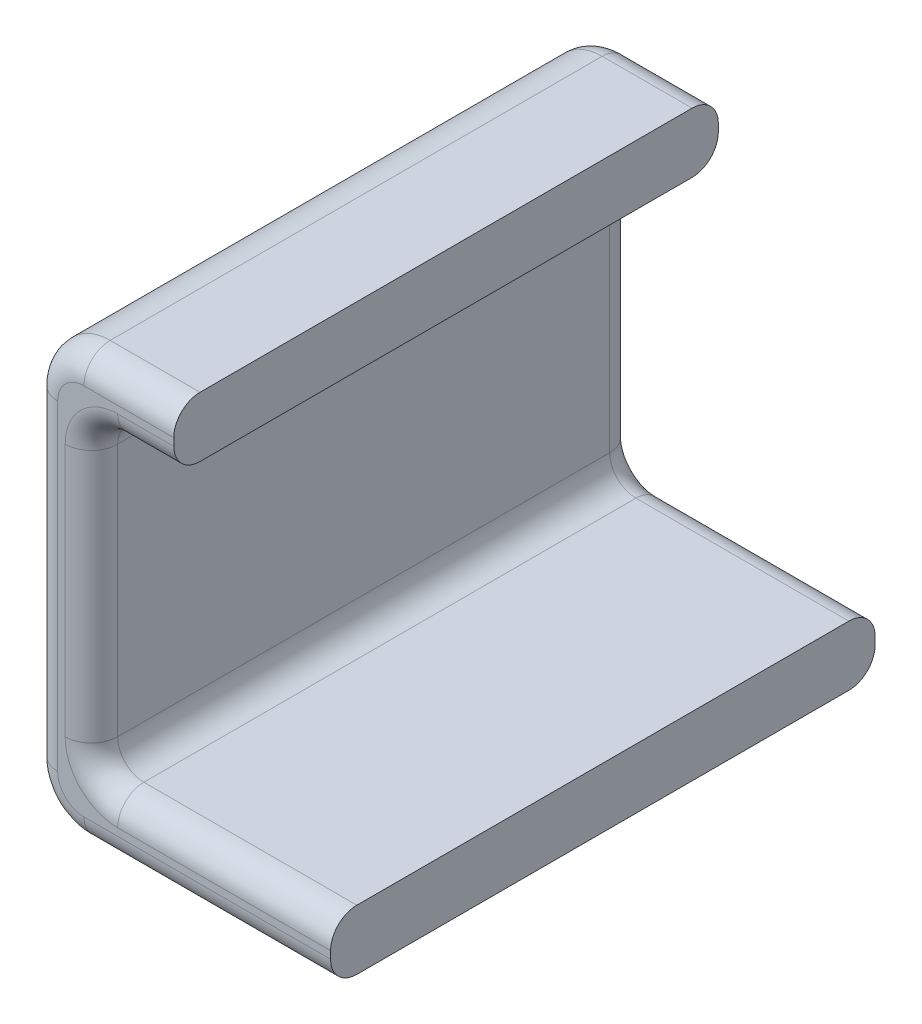
ISO-10303-21;
HEADER;
FILE_DESCRIPTION(('STEP AP214'),'2;1');
FILE_NAME('part.step','',(''),(''),'','','');
FILE_SCHEMA(('AUTOMOTIVE_DESIGN { 1 0 10303 214 1 1 1 1 }'));
ENDSEC;
DATA;
#1=APPLICATION_CONTEXT('core data for automotive mechanical design processes');
#2=APPLICATION_PROTOCOL_DEFINITION('international standard','automotive_design',2000,#1);
#3=PRODUCT_CONTEXT('',#1,'mechanical');
#4=PRODUCT('Part','Part','',(#3));
#5=PRODUCT_RELATED_PRODUCT_CATEGORY('part','',(#4));
#6=PRODUCT_DEFINITION_FORMATION('','',#4);
#7=PRODUCT_DEFINITION_CONTEXT('part definition',#1,'design');
#8=PRODUCT_DEFINITION('design','',#6,#7);
#9=PRODUCT_DEFINITION_SHAPE('','',#8);
#10=(LENGTH_UNIT() NAMED_UNIT(*) SI_UNIT(.MILLI.,.METRE.));
#11=(NAMED_UNIT(*) PLANE_ANGLE_UNIT() SI_UNIT($,.RADIAN.));
#12=(NAMED_UNIT(*) SI_UNIT($,.STERADIAN.) SOLID_ANGLE_UNIT());
#13=UNCERTAINTY_MEASURE_WITH_UNIT(LENGTH_MEASURE(1.E-05),#10,'distance_accuracy_value','');
#14=(GEOMETRIC_REPRESENTATION_CONTEXT(3) GLOBAL_UNCERTAINTY_ASSIGNED_CONTEXT((#13)) GLOBAL_UNIT_ASSIGNED_CONTEXT((#10,
#11,#12)) REPRESENTATION_CONTEXT('',''));
#15=CARTESIAN_POINT('',(0.,0.,0.));
#16=DIRECTION('',(0.,0.,1.));
#17=DIRECTION('',(1.,0.,0.));
#18=AXIS2_PLACEMENT_3D('',#15,#16,#17);
#19=CARTESIAN_POINT('',(-0.344802691004,-0.07991600827582,2.075));
#20=DIRECTION('',(0.,0.,1.));
#21=DIRECTION('',(1.,0.,0.));
#22=AXIS2_PLACEMENT_3D('',#19,#20,#21);
#23=PLANE('',#22);
#24=DIRECTION('',(-1.,0.,0.));
#25=VECTOR('',#24,1.);
#26=CARTESIAN_POINT('',(-0.408714725784,0.738201292228,2.075));
#27=LINE('',#26,#25);
#28=CARTESIAN_POINT('',(-0.158626760563,0.738201292228,2.075));
#29=VERTEX_POINT('',#28);
#30=CARTESIAN_POINT('',(-0.372626760563,0.738201292228,2.075));
#31=VERTEX_POINT('',#30);
#32=EDGE_CURVE('E253',#29,#31,#27,.T.);
#33=ORIENTED_EDGE('',*,*,#32,.F.);
#34=DIRECTION('',(0.,1.,0.));
#35=VECTOR('',#34,1.);
#36=CARTESIAN_POINT('',(-0.158626760563,0.866701292228,2.075));
#37=LINE('',#36,#35);
#38=CARTESIAN_POINT('',(-0.158626760563,0.766701292228,2.075));
#39=VERTEX_POINT('',#38);
#40=EDGE_CURVE('E11',#29,#39,#37,.T.);
#41=ORIENTED_EDGE('',*,*,#40,.T.);
#42=DIRECTION('',(1.,0.,0.));
#43=VECTOR('',#42,1.);
#44=CARTESIAN_POINT('',(-0.251714725784,0.766701292228,2.075));
#45=LINE('',#44,#43);
#46=CARTESIAN_POINT('',(-0.501126760563,0.766701292228,2.075));
#47=VERTEX_POINT('',#46);
#48=EDGE_CURVE('E444',#47,#39,#45,.T.);
#49=ORIENTED_EDGE('',*,*,#48,.F.);
#50=CARTESIAN_POINT('',(-0.501126760563,0.666701292228,2.075));
#51=DIRECTION('',(0.,0.,-1.));
#52=DIRECTION('',(-0.707106781186548,0.707106781186548,0.));
#53=AXIS2_PLACEMENT_3D('',#50,#51,#52);
#54=CIRCLE('',#53,0.1);
#55=CARTESIAN_POINT('',(-0.601126760563,0.666701292228,2.075));
#56=VERTEX_POINT('',#55);
#57=EDGE_CURVE('E383',#56,#47,#54,.T.);
#58=ORIENTED_EDGE('',*,*,#57,.F.);
#59=DIRECTION('',(0.,1.,0.));
#60=VECTOR('',#59,1.);
#61=CARTESIAN_POINT('',(-0.601126760563,0.393392641976,2.075));
#62=LINE('',#61,#60);
#63=CARTESIAN_POINT('',(-0.601126760563,-0.555798707772,2.075));
#64=VERTEX_POINT('',#63);
#65=EDGE_CURVE('E387',#64,#56,#62,.T.);
#66=ORIENTED_EDGE('',*,*,#65,.F.);
#67=CARTESIAN_POINT('',(-0.501126760563,-0.555798707772,2.075));
#68=DIRECTION('',(0.,0.,-1.));
#69=DIRECTION('',(-0.707106781186548,-0.707106781186548,0.));
#70=AXIS2_PLACEMENT_3D('',#67,#68,#69);
#71=CIRCLE('',#70,0.1);
#72=CARTESIAN_POINT('',(-0.501126760563,-0.655798707772,2.075));
#73=VERTEX_POINT('',#72);
#74=EDGE_CURVE('E20',#73,#64,#71,.T.);
#75=ORIENTED_EDGE('',*,*,#74,.F.);
#76=DIRECTION('',(-1.,0.,0.));
#77=VECTOR('',#76,1.);
#78=CARTESIAN_POINT('',(-0.522964725784,-0.655798707772,2.075));
#79=LINE('',#78,#77);
#80=CARTESIAN_POINT('',(0.438873239437,-0.655798707772,2.075));
#81=VERTEX_POINT('',#80);
#82=EDGE_CURVE('E26',#81,#73,#79,.T.);
#83=ORIENTED_EDGE('',*,*,#82,.F.);
#84=DIRECTION('',(0.,1.,0.));
#85=VECTOR('',#84,1.);
#86=CARTESIAN_POINT('',(0.438873239437,-0.527298707772,2.075));
#87=LINE('',#86,#85);
#88=CARTESIAN_POINT('',(0.438873239437,-0.627298707772,2.075));
#89=VERTEX_POINT('',#88);
#90=EDGE_CURVE('E271',#81,#89,#87,.T.);
#91=ORIENTED_EDGE('',*,*,#90,.T.);
#92=DIRECTION('',(1.,0.,0.));
#93=VECTOR('',#92,1.);
#94=CARTESIAN_POINT('',(0.04703527421641,-0.627298707772,2.075));
#95=LINE('',#94,#93);
#96=CARTESIAN_POINT('',(-0.372626760563,-0.627298707772,2.075));
#97=VERTEX_POINT('',#96);
#98=EDGE_CURVE('E318',#97,#89,#95,.T.);
#99=ORIENTED_EDGE('',*,*,#98,.F.);
#100=CARTESIAN_POINT('',(-0.372626760563,-0.427298707772,2.075));
#101=DIRECTION('',(0.,0.,1.));
#102=DIRECTION('',(-0.707106781186548,-0.707106781186548,0.));
#103=AXIS2_PLACEMENT_3D('',#100,#101,#102);
#104=CIRCLE('',#103,0.2);
#105=CARTESIAN_POINT('',(-0.572626760563,-0.427298707772,2.075));
#106=VERTEX_POINT('',#105);
#107=EDGE_CURVE('E354',#106,#97,#104,.T.);
#108=ORIENTED_EDGE('',*,*,#107,.F.);
#109=DIRECTION('',(0.,-1.,0.));
#110=VECTOR('',#109,1.);
#111=CARTESIAN_POINT('',(-0.572626760563,-0.303607358024,2.075));
#112=LINE('',#111,#110);
#113=CARTESIAN_POINT('',(-0.572626760563,0.538201292228,2.075));
#114=VERTEX_POINT('',#113);
#115=EDGE_CURVE('E333',#114,#106,#112,.T.);
#116=ORIENTED_EDGE('',*,*,#115,.F.);
#117=CARTESIAN_POINT('',(-0.372626760563,0.538201292228,2.075));
#118=DIRECTION('',(0.,0.,1.));
#119=DIRECTION('',(-0.707106781186548,0.707106781186548,0.));
#120=AXIS2_PLACEMENT_3D('',#117,#118,#119);
#121=CIRCLE('',#120,0.2);
#122=EDGE_CURVE('E267',#31,#114,#121,.T.);
#123=ORIENTED_EDGE('',*,*,#122,.F.);
#124=EDGE_LOOP('',(#33,#41,#49,#58,#66,#75,#83,#91,#99,#108,#116,#123));
#125=FACE_BOUND('',#124,.T.);
#126=ADVANCED_FACE('F17',(#125),#23,.T.);
#127=CARTESIAN_POINT('',(-0.158626760563,0.638201292228,0.));
#128=DIRECTION('',(1.,0.,0.));
#129=DIRECTION('',(0.,1.,0.));
#130=AXIS2_PLACEMENT_3D('',#127,#128,#129);
#131=PLANE('',#130);
#132=CARTESIAN_POINT('',(-0.158626760563,0.738201292228,0.1));
#133=DIRECTION('',(-1.,0.,0.));
#134=DIRECTION('',(0.,-0.707106781186548,-0.707106781186548));
#135=AXIS2_PLACEMENT_3D('',#132,#133,#134);
#136=CIRCLE('',#135,0.1);
#137=CARTESIAN_POINT('',(-0.158626760563,0.738201292228,0.));
#138=VERTEX_POINT('',#137);
#139=CARTESIAN_POINT('',(-0.158626760563,0.638201292228,0.1));
#140=VERTEX_POINT('',#139);
#141=EDGE_CURVE('E520',#138,#140,#136,.T.);
#142=ORIENTED_EDGE('',*,*,#141,.F.);
#143=DIRECTION('',(0.,-1.,0.));
#144=VECTOR('',#143,1.);
#145=CARTESIAN_POINT('',(-0.158626760563,0.866701292228,0.));
#146=LINE('',#145,#144);
#147=CARTESIAN_POINT('',(-0.158626760563,0.766701292228,0.));
#148=VERTEX_POINT('',#147);
#149=EDGE_CURVE('E409',#148,#138,#146,.T.);
#150=ORIENTED_EDGE('',*,*,#149,.F.);
#151=CARTESIAN_POINT('',(-0.158626760563,0.766701292228,0.1));
#152=DIRECTION('',(-1.,0.,0.));
#153=DIRECTION('',(0.,0.707106781186548,-0.707106781186548));
#154=AXIS2_PLACEMENT_3D('',#151,#152,#153);
#155=CIRCLE('',#154,0.1);
#156=CARTESIAN_POINT('',(-0.158626760563,0.866701292228,0.1));
#157=VERTEX_POINT('',#156);
#158=EDGE_CURVE('E312',#157,#148,#155,.T.);
#159=ORIENTED_EDGE('',*,*,#158,.F.);
#160=DIRECTION('',(0.,0.,1.));
#161=VECTOR('',#160,1.);
#162=CARTESIAN_POINT('',(-0.158626760563,0.866701292228,0.));
#163=LINE('',#162,#161);
#164=CARTESIAN_POINT('',(-0.158626760563,0.866701292228,1.975));
#165=VERTEX_POINT('',#164);
#166=EDGE_CURVE('E328',#157,#165,#163,.T.);
#167=ORIENTED_EDGE('',*,*,#166,.T.);
#168=CARTESIAN_POINT('',(-0.158626760563,0.766701292228,1.975));
#169=DIRECTION('',(-1.,0.,0.));
#170=DIRECTION('',(0.,0.707106781186548,0.707106781186548));
#171=AXIS2_PLACEMENT_3D('',#168,#169,#170);
#172=CIRCLE('',#171,0.1);
#173=EDGE_CURVE('E382',#39,#165,#172,.T.);
#174=ORIENTED_EDGE('',*,*,#173,.F.);
#175=ORIENTED_EDGE('',*,*,#40,.F.);
#176=CARTESIAN_POINT('',(-0.158626760563,0.738201292228,1.975));
#177=DIRECTION('',(-1.,0.,0.));
#178=DIRECTION('',(0.,-0.707106781186548,0.707106781186548));
#179=AXIS2_PLACEMENT_3D('',#176,#177,#178);
#180=CIRCLE('',#179,0.1);
#181=CARTESIAN_POINT('',(-0.158626760563,0.638201292228,1.975));
#182=VERTEX_POINT('',#181);
#183=EDGE_CURVE('E249',#182,#29,#180,.T.);
#184=ORIENTED_EDGE('',*,*,#183,.F.);
#185=DIRECTION('',(0.,0.,1.));
#186=VECTOR('',#185,1.);
#187=CARTESIAN_POINT('',(-0.158626760563,0.638201292228,0.));
#188=LINE('',#187,#186);
#189=EDGE_CURVE('E231',#140,#182,#188,.T.);
#190=ORIENTED_EDGE('',*,*,#189,.F.);
#191=EDGE_LOOP('',(#142,#150,#159,#167,#174,#175,#184,#190));
#192=FACE_BOUND('',#191,.T.);
#193=ADVANCED_FACE('F255',(#192),#131,.T.);
#194=CARTESIAN_POINT('',(-0.522964725784,-0.655798707772,1.975));
#195=DIRECTION('',(1.,0.,0.));
#196=DIRECTION('',(0.,-0.707106781186548,0.707106781186548));
#197=AXIS2_PLACEMENT_3D('',#194,#195,#196);
#198=CYLINDRICAL_SURFACE('',#197,0.1);
#199=CARTESIAN_POINT('',(0.438873239437,-0.655798707772,1.975));
#200=DIRECTION('',(-1.,0.,0.));
#201=DIRECTION('',(0.,-0.707106781186548,0.707106781186548));
#202=AXIS2_PLACEMENT_3D('',#199,#200,#201);
#203=CIRCLE('',#202,0.1);
#204=CARTESIAN_POINT('',(0.438873239437,-0.755798707772,1.975));
#205=VERTEX_POINT('',#204);
#206=EDGE_CURVE('E273',#205,#81,#203,.T.);
#207=ORIENTED_EDGE('',*,*,#206,.T.);
#208=ORIENTED_EDGE('',*,*,#82,.T.);
#209=CARTESIAN_POINT('',(-0.501126760563,-0.655798707772,1.975));
#210=DIRECTION('',(-1.,0.,0.));
#211=DIRECTION('',(0.,-1.,0.));
#212=AXIS2_PLACEMENT_3D('',#209,#210,#211);
#213=CIRCLE('',#212,0.1);
#214=CARTESIAN_POINT('',(-0.501126760563,-0.755798707772,1.975));
#215=VERTEX_POINT('',#214);
#216=EDGE_CURVE('E389',#215,#73,#213,.T.);
#217=ORIENTED_EDGE('',*,*,#216,.F.);
#218=DIRECTION('',(1.,0.,0.));
#219=VECTOR('',#218,1.);
#220=CARTESIAN_POINT('',(-0.522964725784,-0.755798707772,1.975));
#221=LINE('',#220,#219);
#222=EDGE_CURVE('E342',#215,#205,#221,.T.);
#223=ORIENTED_EDGE('',*,*,#222,.T.);
#224=EDGE_LOOP('',(#207,#208,#217,#223));
#225=FACE_BOUND('',#224,.T.);
#226=ADVANCED_FACE('F614',(#225),#198,.T.);
#227=CARTESIAN_POINT('',(-0.501126760563,-0.655798707772,2.075));
#228=CARTESIAN_POINT('',(-0.601126760563,-0.655798707772,2.075));
#229=CARTESIAN_POINT('',(-0.601126760563,-0.555798707772,2.075));
#230=CARTESIAN_POINT('',(-0.501126760563,-0.755798707772,2.075));
#231=CARTESIAN_POINT('',(-0.701126760563,-0.755798707772,2.075));
#232=CARTESIAN_POINT('',(-0.701126760562999,-0.555798707772,2.075));
#233=CARTESIAN_POINT('',(-0.501126760563,-0.755798707772,1.975));
#234=CARTESIAN_POINT('',(-0.701126760562999,-0.755798707772,1.975));
#235=CARTESIAN_POINT('',(-0.701126760563,-0.555798707772,1.975));
#236=(BOUNDED_SURFACE() B_SPLINE_SURFACE(2,2,((#227,#228,#229),(#230,#231,#232),(#233,#234,
#235)),.UNSPECIFIED.,.F.,.F.,.F.) B_SPLINE_SURFACE_WITH_KNOTS((3,3),(3,3),(-1.570796326795,0.),
(-1.570796326795,0.),
.UNSPECIFIED.) GEOMETRIC_REPRESENTATION_ITEM() RATIONAL_B_SPLINE_SURFACE(((1.,0.707106781187,
1.),(0.707106781187,0.5,0.707106781187),(1.,0.707106781187,1.))) REPRESENTATION_ITEM('') SURFACE());
#237=CARTESIAN_POINT('',(-0.601126760563,-0.555798707772,1.975));
#238=DIRECTION('',(0.,1.,0.));
#239=DIRECTION('',(-1.,0.,0.));
#240=AXIS2_PLACEMENT_3D('',#237,#238,#239);
#241=CIRCLE('',#240,0.1);
#242=CARTESIAN_POINT('',(-0.701126760563,-0.555798707772,1.975));
#243=VERTEX_POINT('',#242);
#244=EDGE_CURVE('E385',#243,#64,#241,.T.);
#245=CARTESIAN_POINT('',(-0.501126760563,-0.555798707772,1.975));
#246=DIRECTION('',(0.,0.,1.));
#247=DIRECTION('',(-0.707106781186548,-0.707106781186548,0.));
#248=AXIS2_PLACEMENT_3D('',#245,#246,#247);
#249=CIRCLE('',#248,0.2);
#250=EDGE_CURVE('E345',#243,#215,#249,.T.);
#251=ORIENTED_EDGE('',*,*,#216,.T.);
#252=ORIENTED_EDGE('',*,*,#74,.T.);
#253=ORIENTED_EDGE('',*,*,#244,.F.);
#254=ORIENTED_EDGE('',*,*,#250,.T.);
#255=EDGE_LOOP('',(#251,#252,#253,#254));
#256=FACE_BOUND('',#255,.T.);
#257=ADVANCED_FACE('F680',(#256),#236,.F.);
#258=CARTESIAN_POINT('',(-0.601126760563,0.393392641976,1.975));
#259=DIRECTION('',(0.,-1.,0.));
#260=DIRECTION('',(-0.707106781186548,0.,0.707106781186548));
#261=AXIS2_PLACEMENT_3D('',#258,#259,#260);
#262=CYLINDRICAL_SURFACE('',#261,0.1);
#263=ORIENTED_EDGE('',*,*,#244,.T.);
#264=ORIENTED_EDGE('',*,*,#65,.T.);
#265=CARTESIAN_POINT('',(-0.601126760563,0.666701292228,1.975));
#266=DIRECTION('',(0.,1.,0.));
#267=DIRECTION('',(-1.,0.,0.));
#268=AXIS2_PLACEMENT_3D('',#265,#266,#267);
#269=CIRCLE('',#268,0.1);
#270=CARTESIAN_POINT('',(-0.701126760563,0.666701292228,1.975));
#271=VERTEX_POINT('',#270);
#272=EDGE_CURVE('E386',#271,#56,#269,.T.);
#273=ORIENTED_EDGE('',*,*,#272,.F.);
#274=DIRECTION('',(0.,-1.,0.));
#275=VECTOR('',#274,1.);
#276=CARTESIAN_POINT('',(-0.701126760563,0.393392641976,1.975));
#277=LINE('',#276,#275);
#278=EDGE_CURVE('E305',#271,#243,#277,.T.);
#279=ORIENTED_EDGE('',*,*,#278,.T.);
#280=EDGE_LOOP('',(#263,#264,#273,#279));
#281=FACE_BOUND('',#280,.T.);
#282=ADVANCED_FACE('F672',(#281),#262,.T.);
#283=CARTESIAN_POINT('',(-0.601126760563,0.666701292228,2.075));
#284=CARTESIAN_POINT('',(-0.601126760563,0.766701292228001,2.075));
#285=CARTESIAN_POINT('',(-0.501126760563,0.766701292228,2.075));
#286=CARTESIAN_POINT('',(-0.701126760562999,0.666701292228001,2.075));
#287=CARTESIAN_POINT('',(-0.701126760563,0.866701292228,2.075));
#288=CARTESIAN_POINT('',(-0.501126760563,0.866701292228001,2.075));
#289=CARTESIAN_POINT('',(-0.701126760563,0.666701292228,1.975));
#290=CARTESIAN_POINT('',(-0.701126760562999,0.866701292228001,1.975));
#291=CARTESIAN_POINT('',(-0.501126760563,0.866701292228,1.975));
#292=(BOUNDED_SURFACE() B_SPLINE_SURFACE(2,2,((#283,#284,#285),(#286,#287,#288),(#289,#290,
#291)),.UNSPECIFIED.,.F.,.F.,.F.) B_SPLINE_SURFACE_WITH_KNOTS((3,3),(3,3),(-1.570796326795,0.),
(0.,1.570796326795),
.UNSPECIFIED.) GEOMETRIC_REPRESENTATION_ITEM() RATIONAL_B_SPLINE_SURFACE(((1.,0.707106781187,
1.),(0.707106781187,0.5,0.707106781187),(1.,0.707106781187,1.))) REPRESENTATION_ITEM('') SURFACE());
#293=CARTESIAN_POINT('',(-0.501126760563,0.766701292228,1.975));
#294=DIRECTION('',(1.,0.,0.));
#295=DIRECTION('',(0.,1.,0.));
#296=AXIS2_PLACEMENT_3D('',#293,#294,#295);
#297=CIRCLE('',#296,0.1);
#298=CARTESIAN_POINT('',(-0.501126760563,0.866701292228,1.975));
#299=VERTEX_POINT('',#298);
#300=EDGE_CURVE('E450',#299,#47,#297,.T.);
#301=CARTESIAN_POINT('',(-0.501126760563,0.666701292228,1.975));
#302=DIRECTION('',(0.,0.,1.));
#303=DIRECTION('',(-0.707106781186548,0.707106781186548,0.));
#304=AXIS2_PLACEMENT_3D('',#301,#302,#303);
#305=CIRCLE('',#304,0.2);
#306=EDGE_CURVE('E306',#299,#271,#305,.T.);
#307=ORIENTED_EDGE('',*,*,#272,.T.);
#308=ORIENTED_EDGE('',*,*,#57,.T.);
#309=ORIENTED_EDGE('',*,*,#300,.F.);
#310=ORIENTED_EDGE('',*,*,#306,.T.);
#311=EDGE_LOOP('',(#307,#308,#309,#310));
#312=FACE_BOUND('',#311,.T.);
#313=ADVANCED_FACE('F667',(#312),#292,.F.);
#314=CARTESIAN_POINT('',(-0.251714725784,0.766701292228,1.975));
#315=DIRECTION('',(-1.,0.,0.));
#316=DIRECTION('',(0.,0.707106781186548,0.707106781186548));
#317=AXIS2_PLACEMENT_3D('',#314,#315,#316);
#318=CYLINDRICAL_SURFACE('',#317,0.1);
#319=ORIENTED_EDGE('',*,*,#173,.T.);
#320=DIRECTION('',(-1.,0.,0.));
#321=VECTOR('',#320,1.);
#322=CARTESIAN_POINT('',(-0.251714725784,0.866701292228,1.975));
#323=LINE('',#322,#321);
#324=EDGE_CURVE('E323',#165,#299,#323,.T.);
#325=ORIENTED_EDGE('',*,*,#324,.T.);
#326=ORIENTED_EDGE('',*,*,#300,.T.);
#327=ORIENTED_EDGE('',*,*,#48,.T.);
#328=EDGE_LOOP('',(#319,#325,#326,#327));
#329=FACE_BOUND('',#328,.T.);
#330=ADVANCED_FACE('F660',(#329),#318,.T.);
#331=CARTESIAN_POINT('',(0.438873239437,-0.527298707772,0.));
#332=DIRECTION('',(0.,1.,0.));
#333=DIRECTION('',(1.,0.,0.));
#334=AXIS2_PLACEMENT_3D('',#331,#332,#333);
#335=PLANE('',#334);
#336=DIRECTION('',(1.,0.,0.));
#337=VECTOR('',#336,1.);
#338=CARTESIAN_POINT('',(0.04703527421641,-0.527298707772,0.1));
#339=LINE('',#338,#337);
#340=CARTESIAN_POINT('',(-0.372626760563,-0.527298707772,0.1));
#341=VERTEX_POINT('',#340);
#342=CARTESIAN_POINT('',(0.438873239437,-0.527298707772,0.1));
#343=VERTEX_POINT('',#342);
#344=EDGE_CURVE('E465',#341,#343,#339,.T.);
#345=ORIENTED_EDGE('',*,*,#344,.F.);
#346=DIRECTION('',(0.,0.,-1.));
#347=VECTOR('',#346,1.);
#348=CARTESIAN_POINT('',(-0.372626760563,-0.527298707772,0.));
#349=LINE('',#348,#347);
#350=CARTESIAN_POINT('',(-0.372626760563,-0.527298707772,1.975));
#351=VERTEX_POINT('',#350);
#352=EDGE_CURVE('E379',#351,#341,#349,.T.);
#353=ORIENTED_EDGE('',*,*,#352,.F.);
#354=DIRECTION('',(-1.,0.,0.));
#355=VECTOR('',#354,1.);
#356=CARTESIAN_POINT('',(0.04703527421641,-0.527298707772,1.975));
#357=LINE('',#356,#355);
#358=CARTESIAN_POINT('',(0.438873239437,-0.527298707772,1.975));
#359=VERTEX_POINT('',#358);
#360=EDGE_CURVE('E319',#359,#351,#357,.T.);
#361=ORIENTED_EDGE('',*,*,#360,.F.);
#362=DIRECTION('',(0.,0.,1.));
#363=VECTOR('',#362,1.);
#364=CARTESIAN_POINT('',(0.438873239437,-0.527298707772,0.));
#365=LINE('',#364,#363);
#366=EDGE_CURVE('E411',#343,#359,#365,.T.);
#367=ORIENTED_EDGE('',*,*,#366,.F.);
#368=EDGE_LOOP('',(#345,#353,#361,#367));
#369=FACE_BOUND('',#368,.T.);
#370=ADVANCED_FACE('F655',(#369),#335,.T.);
#371=CARTESIAN_POINT('',(-0.372626760563,-0.427298707772,0.));
#372=DIRECTION('',(0.,0.,1.));
#373=DIRECTION('',(-0.707106781186548,-0.707106781186548,0.));
#374=AXIS2_PLACEMENT_3D('',#371,#372,#373);
#375=CYLINDRICAL_SURFACE('',#374,0.1);
#376=CARTESIAN_POINT('',(-0.372626760563,-0.427298707772,0.1));
#377=DIRECTION('',(0.,0.,1.));
#378=DIRECTION('',(-0.707106781186548,-0.707106781186548,0.));
#379=AXIS2_PLACEMENT_3D('',#376,#377,#378);
#380=CIRCLE('',#379,0.1);
#381=CARTESIAN_POINT('',(-0.472626760563,-0.427298707772,0.1));
#382=VERTEX_POINT('',#381);
#383=EDGE_CURVE('E562',#382,#341,#380,.T.);
#384=ORIENTED_EDGE('',*,*,#383,.F.);
#385=DIRECTION('',(0.,0.,1.));
#386=VECTOR('',#385,1.);
#387=CARTESIAN_POINT('',(-0.472626760563,-0.427298707772,0.));
#388=LINE('',#387,#386);
#389=CARTESIAN_POINT('',(-0.472626760563,-0.427298707772,1.975));
#390=VERTEX_POINT('',#389);
#391=EDGE_CURVE('E373',#382,#390,#388,.T.);
#392=ORIENTED_EDGE('',*,*,#391,.T.);
#393=CARTESIAN_POINT('',(-0.372626760563,-0.427298707772,1.975));
#394=DIRECTION('',(0.,0.,-1.));
#395=DIRECTION('',(-0.707106781186548,-0.707106781186548,0.));
#396=AXIS2_PLACEMENT_3D('',#393,#394,#395);
#397=CIRCLE('',#396,0.1);
#398=EDGE_CURVE('E357',#351,#390,#397,.T.);
#399=ORIENTED_EDGE('',*,*,#398,.F.);
#400=ORIENTED_EDGE('',*,*,#352,.T.);
#401=EDGE_LOOP('',(#384,#392,#399,#400));
#402=FACE_BOUND('',#401,.T.);
#403=ADVANCED_FACE('F637',(#402),#375,.F.);
#404=CARTESIAN_POINT('',(-0.472626760563,-0.527298707772,0.));
#405=DIRECTION('',(1.,0.,0.));
#406=DIRECTION('',(0.,1.,0.));
#407=AXIS2_PLACEMENT_3D('',#404,#405,#406);
#408=PLANE('',#407);
#409=DIRECTION('',(0.,-1.,0.));
#410=VECTOR('',#409,1.);
#411=CARTESIAN_POINT('',(-0.472626760563,-0.303607358024,0.1));
#412=LINE('',#411,#410);
#413=CARTESIAN_POINT('',(-0.472626760563,0.538201292228,0.1));
#414=VERTEX_POINT('',#413);
#415=EDGE_CURVE('E534',#414,#382,#412,.T.);
#416=ORIENTED_EDGE('',*,*,#415,.F.);
#417=DIRECTION('',(0.,0.,-1.));
#418=VECTOR('',#417,1.);
#419=CARTESIAN_POINT('',(-0.472626760563,0.538201292228,0.));
#420=LINE('',#419,#418);
#421=CARTESIAN_POINT('',(-0.472626760563,0.538201292228,1.975));
#422=VERTEX_POINT('',#421);
#423=EDGE_CURVE('E371',#422,#414,#420,.T.);
#424=ORIENTED_EDGE('',*,*,#423,.F.);
#425=DIRECTION('',(0.,1.,0.));
#426=VECTOR('',#425,1.);
#427=CARTESIAN_POINT('',(-0.472626760563,-0.303607358024,1.975));
#428=LINE('',#427,#426);
#429=EDGE_CURVE('E329',#390,#422,#428,.T.);
#430=ORIENTED_EDGE('',*,*,#429,.F.);
#431=ORIENTED_EDGE('',*,*,#391,.F.);
#432=EDGE_LOOP('',(#416,#424,#430,#431));
#433=FACE_BOUND('',#432,.T.);
#434=ADVANCED_FACE('F631',(#433),#408,.T.);
#435=CARTESIAN_POINT('',(-0.372626760563,0.538201292228,0.));
#436=DIRECTION('',(0.,0.,1.));
#437=DIRECTION('',(-0.707106781186548,0.707106781186548,0.));
#438=AXIS2_PLACEMENT_3D('',#435,#436,#437);
#439=CYLINDRICAL_SURFACE('',#438,0.1);
#440=CARTESIAN_POINT('',(-0.372626760563,0.538201292228,0.1));
#441=DIRECTION('',(0.,0.,1.));
#442=DIRECTION('',(-0.707106781186548,0.707106781186548,0.));
#443=AXIS2_PLACEMENT_3D('',#440,#441,#442);
#444=CIRCLE('',#443,0.1);
#445=CARTESIAN_POINT('',(-0.372626760563,0.638201292228,0.1));
#446=VERTEX_POINT('',#445);
#447=EDGE_CURVE('E540',#446,#414,#444,.T.);
#448=ORIENTED_EDGE('',*,*,#447,.F.);
#449=DIRECTION('',(0.,0.,1.));
#450=VECTOR('',#449,1.);
#451=CARTESIAN_POINT('',(-0.372626760563,0.638201292228,0.));
#452=LINE('',#451,#450);
#453=CARTESIAN_POINT('',(-0.372626760563,0.638201292228,1.975));
#454=VERTEX_POINT('',#453);
#455=EDGE_CURVE('E243',#446,#454,#452,.T.);
#456=ORIENTED_EDGE('',*,*,#455,.T.);
#457=CARTESIAN_POINT('',(-0.372626760563,0.538201292228,1.975));
#458=DIRECTION('',(0.,0.,-1.));
#459=DIRECTION('',(-0.707106781186548,0.707106781186548,0.));
#460=AXIS2_PLACEMENT_3D('',#457,#458,#459);
#461=CIRCLE('',#460,0.1);
#462=EDGE_CURVE('E259',#422,#454,#461,.T.);
#463=ORIENTED_EDGE('',*,*,#462,.F.);
#464=ORIENTED_EDGE('',*,*,#423,.T.);
#465=EDGE_LOOP('',(#448,#456,#463,#464));
#466=FACE_BOUND('',#465,.T.);
#467=ADVANCED_FACE('F624',(#466),#439,.F.);
#468=CARTESIAN_POINT('',(-0.472626760563,0.638201292228,0.));
#469=DIRECTION('',(0.,-1.,0.));
#470=DIRECTION('',(0.,0.,-1.));
#471=AXIS2_PLACEMENT_3D('',#468,#469,#470);
#472=PLANE('',#471);
#473=DIRECTION('',(-1.,0.,0.));
#474=VECTOR('',#473,1.);
#475=CARTESIAN_POINT('',(-0.408714725784,0.638201292228,0.1));
#476=LINE('',#475,#474);
#477=EDGE_CURVE('E237',#140,#446,#476,.T.);
#478=ORIENTED_EDGE('',*,*,#477,.F.);
#479=ORIENTED_EDGE('',*,*,#189,.T.);
#480=DIRECTION('',(1.,0.,0.));
#481=VECTOR('',#480,1.);
#482=CARTESIAN_POINT('',(-0.408714725784,0.638201292228,1.975));
#483=LINE('',#482,#481);
#484=EDGE_CURVE('E234',#454,#182,#483,.T.);
#485=ORIENTED_EDGE('',*,*,#484,.F.);
#486=ORIENTED_EDGE('',*,*,#455,.F.);
#487=EDGE_LOOP('',(#478,#479,#485,#486));
#488=FACE_BOUND('',#487,.T.);
#489=ADVANCED_FACE('F233',(#488),#472,.T.);
#490=CARTESIAN_POINT('',(-0.408714725784,0.738201292228,1.975));
#491=DIRECTION('',(1.,0.,0.));
#492=DIRECTION('',(0.,-0.707106781186548,0.707106781186548));
#493=AXIS2_PLACEMENT_3D('',#490,#491,#492);
#494=CYLINDRICAL_SURFACE('',#493,0.1);
#495=ORIENTED_EDGE('',*,*,#183,.T.);
#496=ORIENTED_EDGE('',*,*,#32,.T.);
#497=CARTESIAN_POINT('',(-0.372626760563,0.738201292228,1.975));
#498=DIRECTION('',(-1.,0.,0.));
#499=DIRECTION('',(0.,-1.,0.));
#500=AXIS2_PLACEMENT_3D('',#497,#498,#499);
#501=CIRCLE('',#500,0.1);
#502=EDGE_CURVE('E251',#454,#31,#501,.T.);
#503=ORIENTED_EDGE('',*,*,#502,.F.);
#504=ORIENTED_EDGE('',*,*,#484,.T.);
#505=EDGE_LOOP('',(#495,#496,#503,#504));
#506=FACE_BOUND('',#505,.T.);
#507=ADVANCED_FACE('F248',(#506),#494,.T.);
#508=CARTESIAN_POINT('',(-0.372626760563,0.538201292228,1.975));
#509=DIRECTION('',(0.,0.,1.));
#510=DIRECTION('',(1.,0.,0.));
#511=AXIS2_PLACEMENT_3D('',#508,#509,#510);
#512=TOROIDAL_SURFACE('',#511,0.2,0.1);
#513=ORIENTED_EDGE('',*,*,#502,.T.);
#514=ORIENTED_EDGE('',*,*,#122,.T.);
#515=CARTESIAN_POINT('',(-0.572626760563,0.538201292228,1.975));
#516=DIRECTION('',(0.,-1.,0.));
#517=DIRECTION('',(1.,0.,0.));
#518=AXIS2_PLACEMENT_3D('',#515,#516,#517);
#519=CIRCLE('',#518,0.1);
#520=EDGE_CURVE('E361',#422,#114,#519,.T.);
#521=ORIENTED_EDGE('',*,*,#520,.F.);
#522=ORIENTED_EDGE('',*,*,#462,.T.);
#523=EDGE_LOOP('',(#513,#514,#521,#522));
#524=FACE_BOUND('',#523,.T.);
#525=ADVANCED_FACE('F620',(#524),#512,.T.);
#526=CARTESIAN_POINT('',(-0.572626760563,-0.303607358024,1.975));
#527=DIRECTION('',(0.,1.,0.));
#528=DIRECTION('',(0.707106781186548,0.,0.707106781186548));
#529=AXIS2_PLACEMENT_3D('',#526,#527,#528);
#530=CYLINDRICAL_SURFACE('',#529,0.1);
#531=ORIENTED_EDGE('',*,*,#520,.T.);
#532=ORIENTED_EDGE('',*,*,#115,.T.);
#533=CARTESIAN_POINT('',(-0.572626760563,-0.427298707772,1.975));
#534=DIRECTION('',(0.,-1.,0.));
#535=DIRECTION('',(1.,0.,0.));
#536=AXIS2_PLACEMENT_3D('',#533,#534,#535);
#537=CIRCLE('',#536,0.1);
#538=EDGE_CURVE('E350',#390,#106,#537,.T.);
#539=ORIENTED_EDGE('',*,*,#538,.F.);
#540=ORIENTED_EDGE('',*,*,#429,.T.);
#541=EDGE_LOOP('',(#531,#532,#539,#540));
#542=FACE_BOUND('',#541,.T.);
#543=ADVANCED_FACE('F629',(#542),#530,.T.);
#544=CARTESIAN_POINT('',(-0.372626760563,-0.427298707772,1.975));
#545=DIRECTION('',(0.,0.,1.));
#546=DIRECTION('',(1.,0.,0.));
#547=AXIS2_PLACEMENT_3D('',#544,#545,#546);
#548=TOROIDAL_SURFACE('',#547,0.2,0.1);
#549=ORIENTED_EDGE('',*,*,#538,.T.);
#550=ORIENTED_EDGE('',*,*,#107,.T.);
#551=CARTESIAN_POINT('',(-0.372626760563,-0.627298707772,1.975));
#552=DIRECTION('',(1.,0.,0.));
#553=DIRECTION('',(0.,1.,0.));
#554=AXIS2_PLACEMENT_3D('',#551,#552,#553);
#555=CIRCLE('',#554,0.1);
#556=EDGE_CURVE('E314',#351,#97,#555,.T.);
#557=ORIENTED_EDGE('',*,*,#556,.F.);
#558=ORIENTED_EDGE('',*,*,#398,.T.);
#559=EDGE_LOOP('',(#549,#550,#557,#558));
#560=FACE_BOUND('',#559,.T.);
#561=ADVANCED_FACE('F635',(#560),#548,.T.);
#562=CARTESIAN_POINT('',(0.04703527421641,-0.627298707772,1.975));
#563=DIRECTION('',(-1.,0.,0.));
#564=DIRECTION('',(0.,0.707106781186548,0.707106781186548));
#565=AXIS2_PLACEMENT_3D('',#562,#563,#564);
#566=CYLINDRICAL_SURFACE('',#565,0.1);
#567=CARTESIAN_POINT('',(0.438873239437,-0.627298707772,1.975));
#568=DIRECTION('',(-1.,0.,0.));
#569=DIRECTION('',(0.,0.707106781186548,0.707106781186548));
#570=AXIS2_PLACEMENT_3D('',#567,#568,#569);
#571=CIRCLE('',#570,0.1);
#572=EDGE_CURVE('E420',#89,#359,#571,.T.);
#573=ORIENTED_EDGE('',*,*,#572,.T.);
#574=ORIENTED_EDGE('',*,*,#360,.T.);
#575=ORIENTED_EDGE('',*,*,#556,.T.);
#576=ORIENTED_EDGE('',*,*,#98,.T.);
#577=EDGE_LOOP('',(#573,#574,#575,#576));
#578=FACE_BOUND('',#577,.T.);
#579=ADVANCED_FACE('F835',(#578),#566,.T.);
#580=CARTESIAN_POINT('',(-0.701126760563,-0.755798707772,0.));
#581=DIRECTION('',(0.,-1.,0.));
#582=DIRECTION('',(0.,0.,-1.));
#583=AXIS2_PLACEMENT_3D('',#580,#581,#582);
#584=PLANE('',#583);
#585=DIRECTION('',(-1.,0.,0.));
#586=VECTOR('',#585,1.);
#587=CARTESIAN_POINT('',(-0.522964725784,-0.755798707772,0.1));
#588=LINE('',#587,#586);
#589=CARTESIAN_POINT('',(0.438873239437,-0.755798707772,0.1));
#590=VERTEX_POINT('',#589);
#591=CARTESIAN_POINT('',(-0.501126760563,-0.755798707772,0.1));
#592=VERTEX_POINT('',#591);
#593=EDGE_CURVE('E283',#590,#592,#588,.T.);
#594=ORIENTED_EDGE('',*,*,#593,.F.);
#595=DIRECTION('',(0.,0.,1.));
#596=VECTOR('',#595,1.);
#597=CARTESIAN_POINT('',(0.438873239437,-0.755798707772,0.));
#598=LINE('',#597,#596);
#599=EDGE_CURVE('E275',#590,#205,#598,.T.);
#600=ORIENTED_EDGE('',*,*,#599,.T.);
#601=ORIENTED_EDGE('',*,*,#222,.F.);
#602=DIRECTION('',(0.,0.,1.));
#603=VECTOR('',#602,1.);
#604=CARTESIAN_POINT('',(-0.501126760563,-0.755798707772,0.));
#605=LINE('',#604,#603);
#606=EDGE_CURVE('E341',#592,#215,#605,.T.);
#607=ORIENTED_EDGE('',*,*,#606,.F.);
#608=EDGE_LOOP('',(#594,#600,#601,#607));
#609=FACE_BOUND('',#608,.T.);
#610=ADVANCED_FACE('F495',(#609),#584,.T.);
#611=CARTESIAN_POINT('',(-0.501126760563,-0.555798707772,0.));
#612=DIRECTION('',(0.,0.,1.));
#613=DIRECTION('',(-0.707106781186548,-0.707106781186548,0.));
#614=AXIS2_PLACEMENT_3D('',#611,#612,#613);
#615=CYLINDRICAL_SURFACE('',#614,0.2);
#616=CARTESIAN_POINT('',(-0.501126760563,-0.555798707772,0.1));
#617=DIRECTION('',(0.,0.,-1.));
#618=DIRECTION('',(-0.707106781186548,-0.707106781186548,0.));
#619=AXIS2_PLACEMENT_3D('',#616,#617,#618);
#620=CIRCLE('',#619,0.2);
#621=CARTESIAN_POINT('',(-0.701126760563,-0.555798707772,0.1));
#622=VERTEX_POINT('',#621);
#623=EDGE_CURVE('E293',#592,#622,#620,.T.);
#624=ORIENTED_EDGE('',*,*,#623,.F.);
#625=ORIENTED_EDGE('',*,*,#606,.T.);
#626=ORIENTED_EDGE('',*,*,#250,.F.);
#627=DIRECTION('',(0.,0.,-1.));
#628=VECTOR('',#627,1.);
#629=CARTESIAN_POINT('',(-0.701126760563,-0.555798707772,0.));
#630=LINE('',#629,#628);
#631=EDGE_CURVE('E302',#243,#622,#630,.T.);
#632=ORIENTED_EDGE('',*,*,#631,.T.);
#633=EDGE_LOOP('',(#624,#625,#626,#632));
#634=FACE_BOUND('',#633,.T.);
#635=ADVANCED_FACE('F503',(#634),#615,.T.);
#636=CARTESIAN_POINT('',(-0.701126760563,0.866701292228,0.));
#637=DIRECTION('',(-1.,0.,0.));
#638=DIRECTION('',(0.,1.,0.));
#639=AXIS2_PLACEMENT_3D('',#636,#637,#638);
#640=PLANE('',#639);
#641=DIRECTION('',(0.,1.,0.));
#642=VECTOR('',#641,1.);
#643=CARTESIAN_POINT('',(-0.701126760563,0.393392641976,0.1));
#644=LINE('',#643,#642);
#645=CARTESIAN_POINT('',(-0.701126760563,0.666701292228,0.1));
#646=VERTEX_POINT('',#645);
#647=EDGE_CURVE('E297',#622,#646,#644,.T.);
#648=ORIENTED_EDGE('',*,*,#647,.F.);
#649=ORIENTED_EDGE('',*,*,#631,.F.);
#650=ORIENTED_EDGE('',*,*,#278,.F.);
#651=DIRECTION('',(0.,0.,1.));
#652=VECTOR('',#651,1.);
#653=CARTESIAN_POINT('',(-0.701126760563,0.666701292228,0.));
#654=LINE('',#653,#652);
#655=EDGE_CURVE('E334',#646,#271,#654,.T.);
#656=ORIENTED_EDGE('',*,*,#655,.F.);
#657=EDGE_LOOP('',(#648,#649,#650,#656));
#658=FACE_BOUND('',#657,.T.);
#659=ADVANCED_FACE('F778',(#658),#640,.T.);
#660=CARTESIAN_POINT('',(-0.501126760563,0.666701292228,0.));
#661=DIRECTION('',(0.,0.,1.));
#662=DIRECTION('',(-0.707106781186548,0.707106781186548,0.));
#663=AXIS2_PLACEMENT_3D('',#660,#661,#662);
#664=CYLINDRICAL_SURFACE('',#663,0.2);
#665=CARTESIAN_POINT('',(-0.501126760563,0.666701292228,0.1));
#666=DIRECTION('',(0.,0.,-1.));
#667=DIRECTION('',(-0.707106781186548,0.707106781186548,0.));
#668=AXIS2_PLACEMENT_3D('',#665,#666,#667);
#669=CIRCLE('',#668,0.2);
#670=CARTESIAN_POINT('',(-0.501126760563,0.866701292228,0.1));
#671=VERTEX_POINT('',#670);
#672=EDGE_CURVE('E309',#646,#671,#669,.T.);
#673=ORIENTED_EDGE('',*,*,#672,.F.);
#674=ORIENTED_EDGE('',*,*,#655,.T.);
#675=ORIENTED_EDGE('',*,*,#306,.F.);
#676=DIRECTION('',(0.,0.,-1.));
#677=VECTOR('',#676,1.);
#678=CARTESIAN_POINT('',(-0.501126760563,0.866701292228,0.));
#679=LINE('',#678,#677);
#680=EDGE_CURVE('E320',#299,#671,#679,.T.);
#681=ORIENTED_EDGE('',*,*,#680,.T.);
#682=EDGE_LOOP('',(#673,#674,#675,#681));
#683=FACE_BOUND('',#682,.T.);
#684=ADVANCED_FACE('F801',(#683),#664,.T.);
#685=CARTESIAN_POINT('',(-0.158626760563,0.866701292228,0.));
#686=DIRECTION('',(0.,1.,0.));
#687=DIRECTION('',(1.,0.,0.));
#688=AXIS2_PLACEMENT_3D('',#685,#686,#687);
#689=PLANE('',#688);
#690=DIRECTION('',(1.,0.,0.));
#691=VECTOR('',#690,1.);
#692=CARTESIAN_POINT('',(-0.251714725784,0.866701292228,0.1));
#693=LINE('',#692,#691);
#694=EDGE_CURVE('E324',#671,#157,#693,.T.);
#695=ORIENTED_EDGE('',*,*,#694,.F.);
#696=ORIENTED_EDGE('',*,*,#680,.F.);
#697=ORIENTED_EDGE('',*,*,#324,.F.);
#698=ORIENTED_EDGE('',*,*,#166,.F.);
#699=EDGE_LOOP('',(#695,#696,#697,#698));
#700=FACE_BOUND('',#699,.T.);
#701=ADVANCED_FACE('F796',(#700),#689,.T.);
#702=CARTESIAN_POINT('',(-0.251714725784,0.766701292228,0.1));
#703=DIRECTION('',(1.,0.,0.));
#704=DIRECTION('',(0.,0.707106781186548,-0.707106781186548));
#705=AXIS2_PLACEMENT_3D('',#702,#703,#704);
#706=CYLINDRICAL_SURFACE('',#705,0.1);
#707=ORIENTED_EDGE('',*,*,#158,.T.);
#708=DIRECTION('',(-1.,0.,0.));
#709=VECTOR('',#708,1.);
#710=CARTESIAN_POINT('',(-0.251714725784,0.766701292228,0.));
#711=LINE('',#710,#709);
#712=CARTESIAN_POINT('',(-0.501126760563,0.766701292228,0.));
#713=VERTEX_POINT('',#712);
#714=EDGE_CURVE('E404',#148,#713,#711,.T.);
#715=ORIENTED_EDGE('',*,*,#714,.T.);
#716=CARTESIAN_POINT('',(-0.501126760563,0.766701292228,0.1));
#717=DIRECTION('',(-1.,0.,0.));
#718=DIRECTION('',(0.,1.,0.));
#719=AXIS2_PLACEMENT_3D('',#716,#717,#718);
#720=CIRCLE('',#719,0.1);
#721=EDGE_CURVE('E301',#671,#713,#720,.T.);
#722=ORIENTED_EDGE('',*,*,#721,.F.);
#723=ORIENTED_EDGE('',*,*,#694,.T.);
#724=EDGE_LOOP('',(#707,#715,#722,#723));
#725=FACE_BOUND('',#724,.T.);
#726=ADVANCED_FACE('F512',(#725),#706,.T.);
#727=CARTESIAN_POINT('',(-0.501126760563,0.766701292228,0.));
#728=CARTESIAN_POINT('',(-0.601126760563,0.766701292228001,0.));
#729=CARTESIAN_POINT('',(-0.601126760563,0.666701292228,0.));
#730=CARTESIAN_POINT('',(-0.501126760563,0.866701292228001,0.));
#731=CARTESIAN_POINT('',(-0.701126760563,0.866701292228,0.));
#732=CARTESIAN_POINT('',(-0.701126760562999,0.666701292228001,0.));
#733=CARTESIAN_POINT('',(-0.501126760563,0.866701292228,0.1));
#734=CARTESIAN_POINT('',(-0.701126760562999,0.866701292228001,0.1));
#735=CARTESIAN_POINT('',(-0.701126760563,0.666701292228,0.1));
#736=(BOUNDED_SURFACE() B_SPLINE_SURFACE(2,2,((#727,#728,#729),(#730,#731,#732),(#733,#734,
#735)),.UNSPECIFIED.,.F.,.F.,.F.) B_SPLINE_SURFACE_WITH_KNOTS((3,3),(3,3),(-1.570796326795,0.),
(1.570796326795,3.14159265359),
.UNSPECIFIED.) GEOMETRIC_REPRESENTATION_ITEM() RATIONAL_B_SPLINE_SURFACE(((1.,0.707106781187,
1.),(0.707106781187,0.5,0.707106781187),(1.,0.707106781187,1.))) REPRESENTATION_ITEM('') SURFACE());
#737=CARTESIAN_POINT('',(-0.501126760563,0.666701292228,0.));
#738=DIRECTION('',(0.,0.,1.));
#739=DIRECTION('',(-0.707106781186548,0.707106781186548,0.));
#740=AXIS2_PLACEMENT_3D('',#737,#738,#739);
#741=CIRCLE('',#740,0.1);
#742=CARTESIAN_POINT('',(-0.601126760563,0.666701292228,0.));
#743=VERTEX_POINT('',#742);
#744=EDGE_CURVE('E423',#713,#743,#741,.T.);
#745=CARTESIAN_POINT('',(-0.601126760563,0.666701292228,0.1));
#746=DIRECTION('',(0.,-1.,0.));
#747=DIRECTION('',(-1.,0.,0.));
#748=AXIS2_PLACEMENT_3D('',#745,#746,#747);
#749=CIRCLE('',#748,0.1);
#750=EDGE_CURVE('E294',#646,#743,#749,.T.);
#751=ORIENTED_EDGE('',*,*,#721,.T.);
#752=ORIENTED_EDGE('',*,*,#744,.T.);
#753=ORIENTED_EDGE('',*,*,#750,.F.);
#754=ORIENTED_EDGE('',*,*,#672,.T.);
#755=EDGE_LOOP('',(#751,#752,#753,#754));
#756=FACE_BOUND('',#755,.T.);
#757=ADVANCED_FACE('F508',(#756),#736,.F.);
#758=CARTESIAN_POINT('',(-0.601126760563,0.393392641976,0.1));
#759=DIRECTION('',(0.,1.,0.));
#760=DIRECTION('',(-0.707106781186548,0.,-0.707106781186548));
#761=AXIS2_PLACEMENT_3D('',#758,#759,#760);
#762=CYLINDRICAL_SURFACE('',#761,0.1);
#763=ORIENTED_EDGE('',*,*,#750,.T.);
#764=DIRECTION('',(0.,-1.,0.));
#765=VECTOR('',#764,1.);
#766=CARTESIAN_POINT('',(-0.601126760563,0.393392641976,0.));
#767=LINE('',#766,#765);
#768=CARTESIAN_POINT('',(-0.601126760563,-0.555798707772,0.));
#769=VERTEX_POINT('',#768);
#770=EDGE_CURVE('E431',#743,#769,#767,.T.);
#771=ORIENTED_EDGE('',*,*,#770,.T.);
#772=CARTESIAN_POINT('',(-0.601126760563,-0.555798707772,0.1));
#773=DIRECTION('',(0.,-1.,0.));
#774=DIRECTION('',(-1.,0.,0.));
#775=AXIS2_PLACEMENT_3D('',#772,#773,#774);
#776=CIRCLE('',#775,0.1);
#777=EDGE_CURVE('E290',#622,#769,#776,.T.);
#778=ORIENTED_EDGE('',*,*,#777,.F.);
#779=ORIENTED_EDGE('',*,*,#647,.T.);
#780=EDGE_LOOP('',(#763,#771,#778,#779));
#781=FACE_BOUND('',#780,.T.);
#782=ADVANCED_FACE('F507',(#781),#762,.T.);
#783=CARTESIAN_POINT('',(-0.601126760563,-0.555798707772,0.));
#784=CARTESIAN_POINT('',(-0.601126760563,-0.655798707772,0.));
#785=CARTESIAN_POINT('',(-0.501126760563,-0.655798707772,0.));
#786=CARTESIAN_POINT('',(-0.701126760562999,-0.555798707772,0.));
#787=CARTESIAN_POINT('',(-0.701126760563,-0.755798707772,0.));
#788=CARTESIAN_POINT('',(-0.501126760563,-0.755798707772,0.));
#789=CARTESIAN_POINT('',(-0.701126760563,-0.555798707772,0.1));
#790=CARTESIAN_POINT('',(-0.701126760562999,-0.755798707772,0.1));
#791=CARTESIAN_POINT('',(-0.501126760563,-0.755798707772,0.1));
#792=(BOUNDED_SURFACE() B_SPLINE_SURFACE(2,2,((#783,#784,#785),(#786,#787,#788),(#789,#790,
#791)),.UNSPECIFIED.,.F.,.F.,.F.) B_SPLINE_SURFACE_WITH_KNOTS((3,3),(3,3),(-1.570796326795,0.),
(-3.14159265359,-1.570796326795),
.UNSPECIFIED.) GEOMETRIC_REPRESENTATION_ITEM() RATIONAL_B_SPLINE_SURFACE(((1.,0.707106781187,
1.),(0.707106781187,0.5,0.707106781187),(1.,0.707106781187,1.))) REPRESENTATION_ITEM('') SURFACE());
#793=CARTESIAN_POINT('',(-0.501126760563,-0.555798707772,0.));
#794=DIRECTION('',(0.,0.,1.));
#795=DIRECTION('',(-0.707106781186548,-0.707106781186548,0.));
#796=AXIS2_PLACEMENT_3D('',#793,#794,#795);
#797=CIRCLE('',#796,0.1);
#798=CARTESIAN_POINT('',(-0.501126760563,-0.655798707772,0.));
#799=VERTEX_POINT('',#798);
#800=EDGE_CURVE('E440',#769,#799,#797,.T.);
#801=CARTESIAN_POINT('',(-0.501126760563,-0.655798707772,0.1));
#802=DIRECTION('',(1.,0.,0.));
#803=DIRECTION('',(0.,-1.,0.));
#804=AXIS2_PLACEMENT_3D('',#801,#802,#803);
#805=CIRCLE('',#804,0.1);
#806=EDGE_CURVE('E287',#592,#799,#805,.T.);
#807=ORIENTED_EDGE('',*,*,#777,.T.);
#808=ORIENTED_EDGE('',*,*,#800,.T.);
#809=ORIENTED_EDGE('',*,*,#806,.F.);
#810=ORIENTED_EDGE('',*,*,#623,.T.);
#811=EDGE_LOOP('',(#807,#808,#809,#810));
#812=FACE_BOUND('',#811,.T.);
#813=ADVANCED_FACE('F487',(#812),#792,.F.);
#814=CARTESIAN_POINT('',(-0.522964725784,-0.655798707772,0.1));
#815=DIRECTION('',(-1.,0.,0.));
#816=DIRECTION('',(0.,-0.707106781186548,-0.707106781186548));
#817=AXIS2_PLACEMENT_3D('',#814,#815,#816);
#818=CYLINDRICAL_SURFACE('',#817,0.1);
#819=CARTESIAN_POINT('',(0.438873239437,-0.655798707772,0.1));
#820=DIRECTION('',(-1.,0.,0.));
#821=DIRECTION('',(0.,-0.707106781186548,-0.707106781186548));
#822=AXIS2_PLACEMENT_3D('',#819,#820,#821);
#823=CIRCLE('',#822,0.1);
#824=CARTESIAN_POINT('',(0.438873239437,-0.655798707772,0.));
#825=VERTEX_POINT('',#824);
#826=EDGE_CURVE('E279',#825,#590,#823,.T.);
#827=ORIENTED_EDGE('',*,*,#826,.T.);
#828=ORIENTED_EDGE('',*,*,#593,.T.);
#829=ORIENTED_EDGE('',*,*,#806,.T.);
#830=DIRECTION('',(1.,0.,0.));
#831=VECTOR('',#830,1.);
#832=CARTESIAN_POINT('',(-0.522964725784,-0.655798707772,0.));
#833=LINE('',#832,#831);
#834=EDGE_CURVE('E473',#799,#825,#833,.T.);
#835=ORIENTED_EDGE('',*,*,#834,.T.);
#836=EDGE_LOOP('',(#827,#828,#829,#835));
#837=FACE_BOUND('',#836,.T.);
#838=ADVANCED_FACE('F492',(#837),#818,.T.);
#839=CARTESIAN_POINT('',(0.438873239437,-0.755798707772,0.));
#840=DIRECTION('',(1.,0.,0.));
#841=DIRECTION('',(0.,1.,0.));
#842=AXIS2_PLACEMENT_3D('',#839,#840,#841);
#843=PLANE('',#842);
#844=CARTESIAN_POINT('',(0.438873239437,-0.627298707772,0.1));
#845=DIRECTION('',(-1.,0.,0.));
#846=DIRECTION('',(0.,0.707106781186548,-0.707106781186548));
#847=AXIS2_PLACEMENT_3D('',#844,#845,#846);
#848=CIRCLE('',#847,0.1);
#849=CARTESIAN_POINT('',(0.438873239437,-0.627298707772,0.));
#850=VERTEX_POINT('',#849);
#851=EDGE_CURVE('E462',#343,#850,#848,.T.);
#852=ORIENTED_EDGE('',*,*,#851,.F.);
#853=ORIENTED_EDGE('',*,*,#366,.T.);
#854=ORIENTED_EDGE('',*,*,#572,.F.);
#855=ORIENTED_EDGE('',*,*,#90,.F.);
#856=ORIENTED_EDGE('',*,*,#206,.F.);
#857=ORIENTED_EDGE('',*,*,#599,.F.);
#858=ORIENTED_EDGE('',*,*,#826,.F.);
#859=DIRECTION('',(0.,-1.,0.));
#860=VECTOR('',#859,1.);
#861=CARTESIAN_POINT('',(0.438873239437,-0.527298707772,0.));
#862=LINE('',#861,#860);
#863=EDGE_CURVE('E469',#850,#825,#862,.T.);
#864=ORIENTED_EDGE('',*,*,#863,.F.);
#865=EDGE_LOOP('',(#852,#853,#854,#855,#856,#857,#858,#864));
#866=FACE_BOUND('',#865,.T.);
#867=ADVANCED_FACE('F592',(#866),#843,.T.);
#868=CARTESIAN_POINT('',(-0.344802691004,-0.07991600827582,0.));
#869=DIRECTION('',(0.,0.,1.));
#870=DIRECTION('',(1.,0.,0.));
#871=AXIS2_PLACEMENT_3D('',#868,#869,#870);
#872=PLANE('',#871);
#873=DIRECTION('',(1.,0.,0.));
#874=VECTOR('',#873,1.);
#875=CARTESIAN_POINT('',(-0.408714725784,0.738201292228,0.));
#876=LINE('',#875,#874);
#877=CARTESIAN_POINT('',(-0.372626760563,0.738201292228,0.));
#878=VERTEX_POINT('',#877);
#879=EDGE_CURVE('E539',#878,#138,#876,.T.);
#880=ORIENTED_EDGE('',*,*,#879,.F.);
#881=CARTESIAN_POINT('',(-0.372626760563,0.538201292228,0.));
#882=DIRECTION('',(0.,0.,-1.));
#883=DIRECTION('',(-0.707106781186548,0.707106781186548,0.));
#884=AXIS2_PLACEMENT_3D('',#881,#882,#883);
#885=CIRCLE('',#884,0.2);
#886=CARTESIAN_POINT('',(-0.572626760563,0.538201292228,0.));
#887=VERTEX_POINT('',#886);
#888=EDGE_CURVE('E543',#887,#878,#885,.T.);
#889=ORIENTED_EDGE('',*,*,#888,.F.);
#890=DIRECTION('',(0.,1.,0.));
#891=VECTOR('',#890,1.);
#892=CARTESIAN_POINT('',(-0.572626760563,-0.303607358024,0.));
#893=LINE('',#892,#891);
#894=CARTESIAN_POINT('',(-0.572626760563,-0.427298707772,0.));
#895=VERTEX_POINT('',#894);
#896=EDGE_CURVE('E531',#895,#887,#893,.T.);
#897=ORIENTED_EDGE('',*,*,#896,.F.);
#898=CARTESIAN_POINT('',(-0.372626760563,-0.427298707772,0.));
#899=DIRECTION('',(0.,0.,-1.));
#900=DIRECTION('',(-0.707106781186548,-0.707106781186548,0.));
#901=AXIS2_PLACEMENT_3D('',#898,#899,#900);
#902=CIRCLE('',#901,0.2);
#903=CARTESIAN_POINT('',(-0.372626760563,-0.627298707772,0.));
#904=VERTEX_POINT('',#903);
#905=EDGE_CURVE('E554',#904,#895,#902,.T.);
#906=ORIENTED_EDGE('',*,*,#905,.F.);
#907=DIRECTION('',(-1.,0.,0.));
#908=VECTOR('',#907,1.);
#909=CARTESIAN_POINT('',(0.04703527421641,-0.627298707772,0.));
#910=LINE('',#909,#908);
#911=EDGE_CURVE('E463',#850,#904,#910,.T.);
#912=ORIENTED_EDGE('',*,*,#911,.F.);
#913=ORIENTED_EDGE('',*,*,#863,.T.);
#914=ORIENTED_EDGE('',*,*,#834,.F.);
#915=ORIENTED_EDGE('',*,*,#800,.F.);
#916=ORIENTED_EDGE('',*,*,#770,.F.);
#917=ORIENTED_EDGE('',*,*,#744,.F.);
#918=ORIENTED_EDGE('',*,*,#714,.F.);
#919=ORIENTED_EDGE('',*,*,#149,.T.);
#920=EDGE_LOOP('',(#880,#889,#897,#906,#912,#913,#914,#915,#916,#917,#918,#919));
#921=FACE_BOUND('',#920,.T.);
#922=ADVANCED_FACE('F489',(#921),#872,.F.);
#923=CARTESIAN_POINT('',(0.04703527421641,-0.627298707772,0.1));
#924=DIRECTION('',(1.,0.,0.));
#925=DIRECTION('',(0.,0.707106781186548,-0.707106781186548));
#926=AXIS2_PLACEMENT_3D('',#923,#924,#925);
#927=CYLINDRICAL_SURFACE('',#926,0.1);
#928=ORIENTED_EDGE('',*,*,#851,.T.);
#929=ORIENTED_EDGE('',*,*,#911,.T.);
#930=CARTESIAN_POINT('',(-0.372626760563,-0.627298707772,0.1));
#931=DIRECTION('',(-1.,0.,0.));
#932=DIRECTION('',(0.,1.,0.));
#933=AXIS2_PLACEMENT_3D('',#930,#931,#932);
#934=CIRCLE('',#933,0.1);
#935=EDGE_CURVE('E550',#341,#904,#934,.T.);
#936=ORIENTED_EDGE('',*,*,#935,.F.);
#937=ORIENTED_EDGE('',*,*,#344,.T.);
#938=EDGE_LOOP('',(#928,#929,#936,#937));
#939=FACE_BOUND('',#938,.T.);
#940=ADVANCED_FACE('F588',(#939),#927,.T.);
#941=CARTESIAN_POINT('',(-0.372626760563,-0.427298707772,0.1));
#942=DIRECTION('',(0.,0.,-1.));
#943=DIRECTION('',(-1.,0.,0.));
#944=AXIS2_PLACEMENT_3D('',#941,#942,#943);
#945=TOROIDAL_SURFACE('',#944,0.2,0.1);
#946=ORIENTED_EDGE('',*,*,#935,.T.);
#947=ORIENTED_EDGE('',*,*,#905,.T.);
#948=CARTESIAN_POINT('',(-0.572626760563,-0.427298707772,0.1));
#949=DIRECTION('',(0.,1.,0.));
#950=DIRECTION('',(1.,0.,0.));
#951=AXIS2_PLACEMENT_3D('',#948,#949,#950);
#952=CIRCLE('',#951,0.1);
#953=EDGE_CURVE('E535',#382,#895,#952,.T.);
#954=ORIENTED_EDGE('',*,*,#953,.F.);
#955=ORIENTED_EDGE('',*,*,#383,.T.);
#956=EDGE_LOOP('',(#946,#947,#954,#955));
#957=FACE_BOUND('',#956,.T.);
#958=ADVANCED_FACE('F596',(#957),#945,.T.);
#959=CARTESIAN_POINT('',(-0.572626760563,-0.303607358024,0.1));
#960=DIRECTION('',(0.,-1.,0.));
#961=DIRECTION('',(0.707106781186548,0.,-0.707106781186548));
#962=AXIS2_PLACEMENT_3D('',#959,#960,#961);
#963=CYLINDRICAL_SURFACE('',#962,0.1);
#964=ORIENTED_EDGE('',*,*,#953,.T.);
#965=ORIENTED_EDGE('',*,*,#896,.T.);
#966=CARTESIAN_POINT('',(-0.572626760563,0.538201292228,0.1));
#967=DIRECTION('',(0.,1.,0.));
#968=DIRECTION('',(1.,0.,0.));
#969=AXIS2_PLACEMENT_3D('',#966,#967,#968);
#970=CIRCLE('',#969,0.1);
#971=EDGE_CURVE('E549',#414,#887,#970,.T.);
#972=ORIENTED_EDGE('',*,*,#971,.F.);
#973=ORIENTED_EDGE('',*,*,#415,.T.);
#974=EDGE_LOOP('',(#964,#965,#972,#973));
#975=FACE_BOUND('',#974,.T.);
#976=ADVANCED_FACE('F598',(#975),#963,.T.);
#977=CARTESIAN_POINT('',(-0.372626760563,0.538201292228,0.1));
#978=DIRECTION('',(0.,0.,-1.));
#979=DIRECTION('',(-1.,0.,0.));
#980=AXIS2_PLACEMENT_3D('',#977,#978,#979);
#981=TOROIDAL_SURFACE('',#980,0.2,0.1);
#982=ORIENTED_EDGE('',*,*,#971,.T.);
#983=ORIENTED_EDGE('',*,*,#888,.T.);
#984=CARTESIAN_POINT('',(-0.372626760563,0.738201292228,0.1));
#985=DIRECTION('',(1.,0.,0.));
#986=DIRECTION('',(0.,-1.,0.));
#987=AXIS2_PLACEMENT_3D('',#984,#985,#986);
#988=CIRCLE('',#987,0.1);
#989=EDGE_CURVE('E526',#446,#878,#988,.T.);
#990=ORIENTED_EDGE('',*,*,#989,.F.);
#991=ORIENTED_EDGE('',*,*,#447,.T.);
#992=EDGE_LOOP('',(#982,#983,#990,#991));
#993=FACE_BOUND('',#992,.T.);
#994=ADVANCED_FACE('F605',(#993),#981,.T.);
#995=CARTESIAN_POINT('',(-0.408714725784,0.738201292228,0.1));
#996=DIRECTION('',(-1.,0.,0.));
#997=DIRECTION('',(0.,-0.707106781186548,-0.707106781186548));
#998=AXIS2_PLACEMENT_3D('',#995,#996,#997);
#999=CYLINDRICAL_SURFACE('',#998,0.1);
#1000=ORIENTED_EDGE('',*,*,#141,.T.);
#1001=ORIENTED_EDGE('',*,*,#477,.T.);
#1002=ORIENTED_EDGE('',*,*,#989,.T.);
#1003=ORIENTED_EDGE('',*,*,#879,.T.);
#1004=EDGE_LOOP('',(#1000,#1001,#1002,#1003));
#1005=FACE_BOUND('',#1004,.T.);
#1006=ADVANCED_FACE('F641',(#1005),#999,.T.);
#1007=CLOSED_SHELL('',(#126,#193,#226,#257,#282,#313,#330,#370,#403,#434,#467,#489,#507,#525,
#543,#561,#579,#610,#635,#659,#684,#701,#726,#757,#782,#813,#838,#867,#922,#940,#958,#976,#994,#1006));
#1008=MANIFOLD_SOLID_BREP('B1',#1007);
#1009=ADVANCED_BREP_SHAPE_REPRESENTATION('',(#18,#1008),#14);
#1010=SHAPE_DEFINITION_REPRESENTATION(#9,#1009);
ENDSEC;
END-ISO-10303-21;
